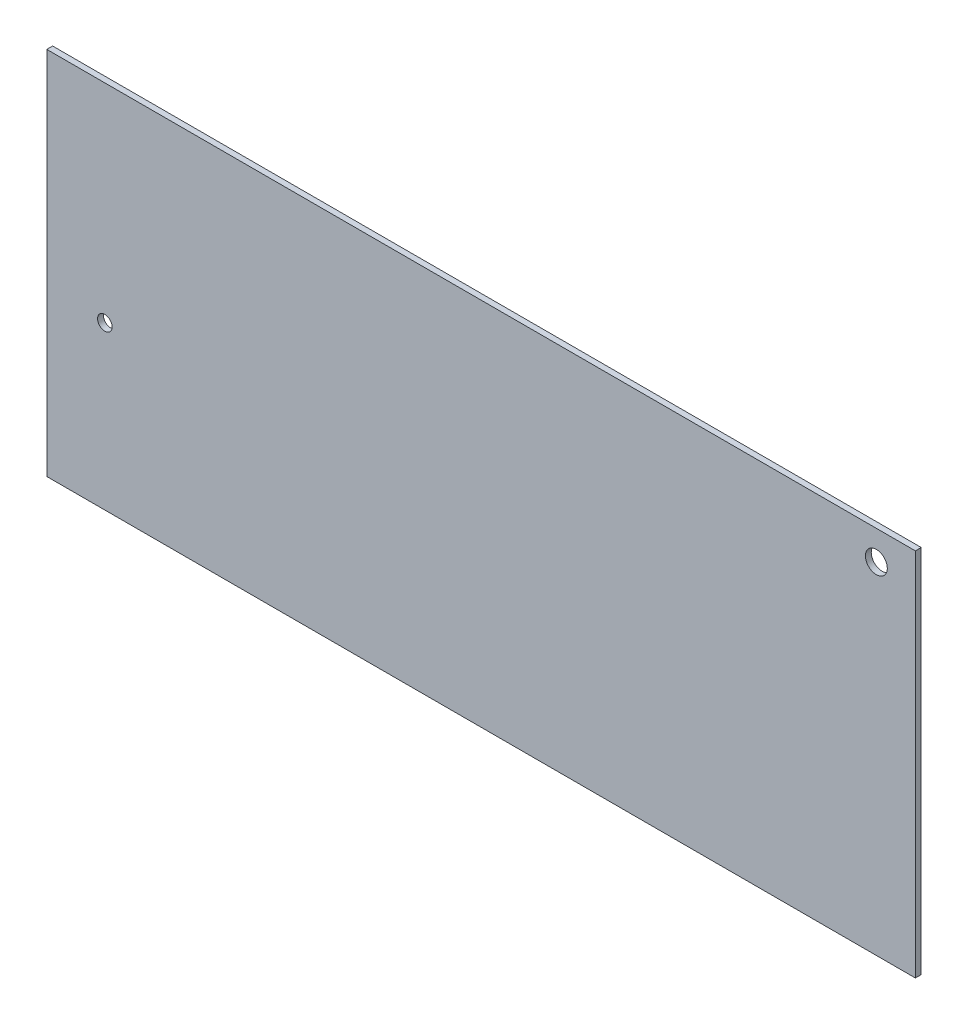
ISO-10303-21;
HEADER;
FILE_DESCRIPTION(('STEP AP214'),'2;1');
FILE_NAME('part.step','',(''),(''),'','','');
FILE_SCHEMA(('AUTOMOTIVE_DESIGN { 1 0 10303 214 1 1 1 1 }'));
ENDSEC;
DATA;
#1=APPLICATION_CONTEXT('core data for automotive mechanical design processes');
#2=APPLICATION_PROTOCOL_DEFINITION('international standard','automotive_design',2000,#1);
#3=PRODUCT_CONTEXT('',#1,'mechanical');
#4=PRODUCT('Part','Part','',(#3));
#5=PRODUCT_RELATED_PRODUCT_CATEGORY('part','',(#4));
#6=PRODUCT_DEFINITION_FORMATION('','',#4);
#7=PRODUCT_DEFINITION_CONTEXT('part definition',#1,'design');
#8=PRODUCT_DEFINITION('design','',#6,#7);
#9=PRODUCT_DEFINITION_SHAPE('','',#8);
#10=(LENGTH_UNIT() NAMED_UNIT(*) SI_UNIT(.MILLI.,.METRE.));
#11=(NAMED_UNIT(*) PLANE_ANGLE_UNIT() SI_UNIT($,.RADIAN.));
#12=(NAMED_UNIT(*) SI_UNIT($,.STERADIAN.) SOLID_ANGLE_UNIT());
#13=UNCERTAINTY_MEASURE_WITH_UNIT(LENGTH_MEASURE(1.E-05),#10,'distance_accuracy_value','');
#14=(GEOMETRIC_REPRESENTATION_CONTEXT(3) GLOBAL_UNCERTAINTY_ASSIGNED_CONTEXT((#13)) GLOBAL_UNIT_ASSIGNED_CONTEXT((#10,
#11,#12)) REPRESENTATION_CONTEXT('',''));
#15=CARTESIAN_POINT('',(0.,0.,0.));
#16=DIRECTION('',(0.,0.,1.));
#17=DIRECTION('',(1.,0.,0.));
#18=AXIS2_PLACEMENT_3D('',#15,#16,#17);
#19=CARTESIAN_POINT('',(121.81373067429,41.9525504230478,2.54));
#20=DIRECTION('',(-1.,0.,0.));
#21=DIRECTION('',(0.,-1.,0.));
#22=AXIS2_PLACEMENT_3D('',#19,#20,#21);
#23=PLANE('',#22);
#24=DIRECTION('',(0.,1.,0.));
#25=VECTOR('',#24,1.);
#26=CARTESIAN_POINT('',(121.81373067429,41.9525504230478,0.));
#27=LINE('',#26,#25);
#28=CARTESIAN_POINT('',(121.81373067429,-118.9537774423,0.));
#29=VERTEX_POINT('',#28);
#30=CARTESIAN_POINT('',(121.81373067429,41.9525504230478,0.));
#31=VERTEX_POINT('',#30);
#32=EDGE_CURVE('E102',#29,#31,#27,.T.);
#33=ORIENTED_EDGE('',*,*,#32,.T.);
#34=DIRECTION('',(0.,0.,-1.));
#35=VECTOR('',#34,1.);
#36=CARTESIAN_POINT('',(121.81373067429,41.9525504230478,2.54));
#37=LINE('',#36,#35);
#38=CARTESIAN_POINT('',(121.81373067429,41.9525504230478,2.54));
#39=VERTEX_POINT('',#38);
#40=EDGE_CURVE('E11',#39,#31,#37,.T.);
#41=ORIENTED_EDGE('',*,*,#40,.F.);
#42=DIRECTION('',(0.,1.,0.));
#43=VECTOR('',#42,1.);
#44=CARTESIAN_POINT('',(121.81373067429,41.9525504230478,2.54));
#45=LINE('',#44,#43);
#46=CARTESIAN_POINT('',(121.81373067429,-118.9537774423,2.54));
#47=VERTEX_POINT('',#46);
#48=EDGE_CURVE('E88',#47,#39,#45,.T.);
#49=ORIENTED_EDGE('',*,*,#48,.F.);
#50=DIRECTION('',(0.,0.,-1.));
#51=VECTOR('',#50,1.);
#52=CARTESIAN_POINT('',(121.81373067429,-118.9537774423,2.54));
#53=LINE('',#52,#51);
#54=EDGE_CURVE('E98',#47,#29,#53,.T.);
#55=ORIENTED_EDGE('',*,*,#54,.T.);
#56=EDGE_LOOP('',(#33,#41,#49,#55));
#57=FACE_BOUND('',#56,.T.);
#58=ADVANCED_FACE('F37',(#57),#23,.F.);
#59=CARTESIAN_POINT('',(-255.985711841106,41.9525504230478,2.54));
#60=DIRECTION('',(0.,-1.,0.));
#61=DIRECTION('',(0.,0.,-1.));
#62=AXIS2_PLACEMENT_3D('',#59,#60,#61);
#63=PLANE('',#62);
#64=DIRECTION('',(-1.,0.,0.));
#65=VECTOR('',#64,1.);
#66=CARTESIAN_POINT('',(-255.985711841106,41.9525504230478,0.));
#67=LINE('',#66,#65);
#68=CARTESIAN_POINT('',(-255.985711841106,41.9525504230478,0.));
#69=VERTEX_POINT('',#68);
#70=EDGE_CURVE('E93',#31,#69,#67,.T.);
#71=ORIENTED_EDGE('',*,*,#70,.T.);
#72=DIRECTION('',(0.,0.,-1.));
#73=VECTOR('',#72,1.);
#74=CARTESIAN_POINT('',(-255.985711841106,41.9525504230478,2.54));
#75=LINE('',#74,#73);
#76=CARTESIAN_POINT('',(-255.985711841106,41.9525504230478,2.54));
#77=VERTEX_POINT('',#76);
#78=EDGE_CURVE('E45',#77,#69,#75,.T.);
#79=ORIENTED_EDGE('',*,*,#78,.F.);
#80=DIRECTION('',(-1.,0.,0.));
#81=VECTOR('',#80,1.);
#82=CARTESIAN_POINT('',(-255.985711841106,41.9525504230478,2.54));
#83=LINE('',#82,#81);
#84=EDGE_CURVE('E83',#39,#77,#83,.T.);
#85=ORIENTED_EDGE('',*,*,#84,.F.);
#86=ORIENTED_EDGE('',*,*,#40,.T.);
#87=EDGE_LOOP('',(#71,#79,#85,#86));
#88=FACE_BOUND('',#87,.T.);
#89=ADVANCED_FACE('F92',(#88),#63,.F.);
#90=CARTESIAN_POINT('',(-255.985711841106,41.9525504230478,2.54));
#91=DIRECTION('',(1.,0.,0.));
#92=DIRECTION('',(0.,0.,-1.));
#93=AXIS2_PLACEMENT_3D('',#90,#91,#92);
#94=PLANE('',#93);
#95=DIRECTION('',(0.,-1.,0.));
#96=VECTOR('',#95,1.);
#97=CARTESIAN_POINT('',(-255.985711841106,41.9525504230478,0.));
#98=LINE('',#97,#96);
#99=CARTESIAN_POINT('',(-255.985711841106,-118.9537774423,0.));
#100=VERTEX_POINT('',#99);
#101=EDGE_CURVE('E70',#69,#100,#98,.T.);
#102=ORIENTED_EDGE('',*,*,#101,.T.);
#103=DIRECTION('',(0.,0.,-1.));
#104=VECTOR('',#103,1.);
#105=CARTESIAN_POINT('',(-255.985711841106,-118.9537774423,2.54));
#106=LINE('',#105,#104);
#107=CARTESIAN_POINT('',(-255.985711841106,-118.9537774423,2.54));
#108=VERTEX_POINT('',#107);
#109=EDGE_CURVE('E94',#108,#100,#106,.T.);
#110=ORIENTED_EDGE('',*,*,#109,.F.);
#111=DIRECTION('',(0.,-1.,0.));
#112=VECTOR('',#111,1.);
#113=CARTESIAN_POINT('',(-255.985711841106,41.9525504230478,2.54));
#114=LINE('',#113,#112);
#115=EDGE_CURVE('E86',#77,#108,#114,.T.);
#116=ORIENTED_EDGE('',*,*,#115,.F.);
#117=ORIENTED_EDGE('',*,*,#78,.T.);
#118=EDGE_LOOP('',(#102,#110,#116,#117));
#119=FACE_BOUND('',#118,.T.);
#120=ADVANCED_FACE('F95',(#119),#94,.F.);
#121=CARTESIAN_POINT('',(-255.985711841106,-118.9537774423,2.54));
#122=DIRECTION('',(0.,1.,0.));
#123=DIRECTION('',(0.,0.,1.));
#124=AXIS2_PLACEMENT_3D('',#121,#122,#123);
#125=PLANE('',#124);
#126=DIRECTION('',(1.,0.,0.));
#127=VECTOR('',#126,1.);
#128=CARTESIAN_POINT('',(-255.985711841106,-118.9537774423,0.));
#129=LINE('',#128,#127);
#130=EDGE_CURVE('E76',#100,#29,#129,.T.);
#131=ORIENTED_EDGE('',*,*,#130,.T.);
#132=ORIENTED_EDGE('',*,*,#54,.F.);
#133=DIRECTION('',(1.,0.,0.));
#134=VECTOR('',#133,1.);
#135=CARTESIAN_POINT('',(-255.985711841106,-118.9537774423,2.54));
#136=LINE('',#135,#134);
#137=EDGE_CURVE('E53',#108,#47,#136,.T.);
#138=ORIENTED_EDGE('',*,*,#137,.F.);
#139=ORIENTED_EDGE('',*,*,#109,.T.);
#140=EDGE_LOOP('',(#131,#132,#138,#139));
#141=FACE_BOUND('',#140,.T.);
#142=ADVANCED_FACE('F112',(#141),#125,.F.);
#143=CARTESIAN_POINT('',(0.,0.,2.54));
#144=DIRECTION('',(0.,0.,1.));
#145=DIRECTION('',(1.,0.,0.));
#146=AXIS2_PLACEMENT_3D('',#143,#144,#145);
#147=PLANE('',#146);
#148=CARTESIAN_POINT('',(-230.736599112741,-48.4349573031975,2.54));
#149=DIRECTION('',(0.,0.,-1.));
#150=DIRECTION('',(-1.,0.,0.));
#151=AXIS2_PLACEMENT_3D('',#148,#149,#150);
#152=CIRCLE('',#151,3.175);
#153=CARTESIAN_POINT('',(-233.911599112741,-48.4349573031975,2.54));
#154=VERTEX_POINT('',#153);
#155=EDGE_CURVE('E121',#154,#154,#152,.T.);
#156=ORIENTED_EDGE('',*,*,#155,.T.);
#157=EDGE_LOOP('',(#156));
#158=FACE_BOUND('',#157,.T.);
#159=CARTESIAN_POINT('',(104.843972105719,29.2525504230478,2.54));
#160=DIRECTION('',(0.,0.,-1.));
#161=DIRECTION('',(-1.,0.,0.));
#162=AXIS2_PLACEMENT_3D('',#159,#160,#161);
#163=CIRCLE('',#162,4.7625);
#164=CARTESIAN_POINT('',(100.081472105719,29.2525504230478,2.54));
#165=VERTEX_POINT('',#164);
#166=EDGE_CURVE('E105',#165,#165,#163,.T.);
#167=ORIENTED_EDGE('',*,*,#166,.T.);
#168=EDGE_LOOP('',(#167));
#169=FACE_BOUND('',#168,.T.);
#170=ORIENTED_EDGE('',*,*,#48,.T.);
#171=ORIENTED_EDGE('',*,*,#84,.T.);
#172=ORIENTED_EDGE('',*,*,#115,.T.);
#173=ORIENTED_EDGE('',*,*,#137,.T.);
#174=EDGE_LOOP('',(#170,#171,#172,#173));
#175=FACE_BOUND('',#174,.T.);
#176=ADVANCED_FACE('F84',(#158,#169,#175),#147,.T.);
#177=CARTESIAN_POINT('',(0.,0.,0.));
#178=DIRECTION('',(0.,0.,1.));
#179=DIRECTION('',(1.,0.,0.));
#180=AXIS2_PLACEMENT_3D('',#177,#178,#179);
#181=PLANE('',#180);
#182=CARTESIAN_POINT('',(-230.736599112741,-48.4349573031975,0.));
#183=DIRECTION('',(0.,0.,-1.));
#184=DIRECTION('',(-1.,0.,0.));
#185=AXIS2_PLACEMENT_3D('',#182,#183,#184);
#186=CIRCLE('',#185,3.175);
#187=CARTESIAN_POINT('',(-233.911599112741,-48.4349573031975,0.));
#188=VERTEX_POINT('',#187);
#189=EDGE_CURVE('E124',#188,#188,#186,.T.);
#190=ORIENTED_EDGE('',*,*,#189,.F.);
#191=EDGE_LOOP('',(#190));
#192=FACE_BOUND('',#191,.T.);
#193=CARTESIAN_POINT('',(104.843972105719,29.2525504230478,0.));
#194=DIRECTION('',(0.,0.,-1.));
#195=DIRECTION('',(-1.,0.,0.));
#196=AXIS2_PLACEMENT_3D('',#193,#194,#195);
#197=CIRCLE('',#196,4.7625);
#198=CARTESIAN_POINT('',(100.081472105719,29.2525504230478,0.));
#199=VERTEX_POINT('',#198);
#200=EDGE_CURVE('E118',#199,#199,#197,.T.);
#201=ORIENTED_EDGE('',*,*,#200,.F.);
#202=EDGE_LOOP('',(#201));
#203=FACE_BOUND('',#202,.T.);
#204=ORIENTED_EDGE('',*,*,#32,.F.);
#205=ORIENTED_EDGE('',*,*,#130,.F.);
#206=ORIENTED_EDGE('',*,*,#101,.F.);
#207=ORIENTED_EDGE('',*,*,#70,.F.);
#208=EDGE_LOOP('',(#204,#205,#206,#207));
#209=FACE_BOUND('',#208,.T.);
#210=ADVANCED_FACE('F115',(#192,#203,#209),#181,.F.);
#211=CARTESIAN_POINT('',(104.843972105719,29.2525504230478,2.54));
#212=DIRECTION('',(0.,0.,-1.));
#213=DIRECTION('',(-1.,0.,0.));
#214=AXIS2_PLACEMENT_3D('',#211,#212,#213);
#215=CYLINDRICAL_SURFACE('',#214,4.7625);
#216=ORIENTED_EDGE('',*,*,#166,.F.);
#217=EDGE_LOOP('',(#216));
#218=FACE_BOUND('',#217,.T.);
#219=ORIENTED_EDGE('',*,*,#200,.T.);
#220=EDGE_LOOP('',(#219));
#221=FACE_BOUND('',#220,.T.);
#222=ADVANCED_FACE('F135',(#218,#221),#215,.F.);
#223=CARTESIAN_POINT('',(-230.736599112741,-48.4349573031975,2.54));
#224=DIRECTION('',(0.,0.,-1.));
#225=DIRECTION('',(-1.,0.,0.));
#226=AXIS2_PLACEMENT_3D('',#223,#224,#225);
#227=CYLINDRICAL_SURFACE('',#226,3.175);
#228=ORIENTED_EDGE('',*,*,#155,.F.);
#229=EDGE_LOOP('',(#228));
#230=FACE_BOUND('',#229,.T.);
#231=ORIENTED_EDGE('',*,*,#189,.T.);
#232=EDGE_LOOP('',(#231));
#233=FACE_BOUND('',#232,.T.);
#234=ADVANCED_FACE('F132',(#230,#233),#227,.F.);
#235=CLOSED_SHELL('',(#58,#89,#120,#142,#176,#210,#222,#234));
#236=MANIFOLD_SOLID_BREP('B2',#235);
#237=ADVANCED_BREP_SHAPE_REPRESENTATION('',(#18,#236),#14);
#238=SHAPE_DEFINITION_REPRESENTATION(#9,#237);
ENDSEC;
END-ISO-10303-21;
